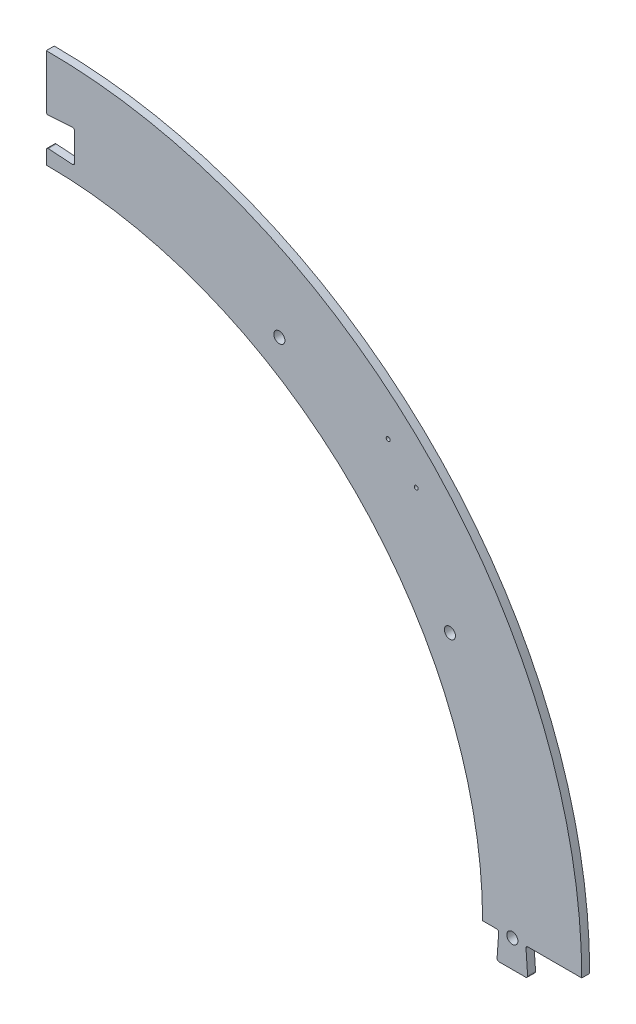
ISO-10303-21;
HEADER;
FILE_DESCRIPTION(('STEP AP214'),'2;1');
FILE_NAME('part.step','',(''),(''),'','','');
FILE_SCHEMA(('AUTOMOTIVE_DESIGN { 1 0 10303 214 1 1 1 1 }'));
ENDSEC;
DATA;
#1=APPLICATION_CONTEXT('core data for automotive mechanical design processes');
#2=APPLICATION_PROTOCOL_DEFINITION('international standard','automotive_design',2000,#1);
#3=PRODUCT_CONTEXT('',#1,'mechanical');
#4=PRODUCT('Part','Part','',(#3));
#5=PRODUCT_RELATED_PRODUCT_CATEGORY('part','',(#4));
#6=PRODUCT_DEFINITION_FORMATION('','',#4);
#7=PRODUCT_DEFINITION_CONTEXT('part definition',#1,'design');
#8=PRODUCT_DEFINITION('design','',#6,#7);
#9=PRODUCT_DEFINITION_SHAPE('','',#8);
#10=(LENGTH_UNIT() NAMED_UNIT(*) SI_UNIT(.MILLI.,.METRE.));
#11=(NAMED_UNIT(*) PLANE_ANGLE_UNIT() SI_UNIT($,.RADIAN.));
#12=(NAMED_UNIT(*) SI_UNIT($,.STERADIAN.) SOLID_ANGLE_UNIT());
#13=UNCERTAINTY_MEASURE_WITH_UNIT(LENGTH_MEASURE(1.E-05),#10,'distance_accuracy_value','');
#14=(GEOMETRIC_REPRESENTATION_CONTEXT(3) GLOBAL_UNCERTAINTY_ASSIGNED_CONTEXT((#13)) GLOBAL_UNIT_ASSIGNED_CONTEXT((#10,
#11,#12)) REPRESENTATION_CONTEXT('',''));
#15=CARTESIAN_POINT('',(0.,0.,0.));
#16=DIRECTION('',(0.,0.,1.));
#17=DIRECTION('',(1.,0.,0.));
#18=AXIS2_PLACEMENT_3D('',#15,#16,#17);
#19=CARTESIAN_POINT('',(0.,135.,2.));
#20=DIRECTION('',(1.,0.,0.));
#21=DIRECTION('',(0.,1.,0.));
#22=AXIS2_PLACEMENT_3D('',#19,#20,#21);
#23=PLANE('',#22);
#24=DIRECTION('',(0.,-1.,0.));
#25=VECTOR('',#24,1.);
#26=CARTESIAN_POINT('',(0.,135.,2.));
#27=LINE('',#26,#25);
#28=CARTESIAN_POINT('',(0.,113.362757049388,2.));
#29=VERTEX_POINT('',#28);
#30=CARTESIAN_POINT('',(0.,110.,2.));
#31=VERTEX_POINT('',#30);
#32=EDGE_CURVE('E240',#29,#31,#27,.T.);
#33=ORIENTED_EDGE('',*,*,#32,.F.);
#34=DIRECTION('',(0.,0.,1.));
#35=VECTOR('',#34,1.);
#36=CARTESIAN_POINT('',(0.,113.362757049388,2.));
#37=LINE('',#36,#35);
#38=CARTESIAN_POINT('',(0.,113.362757049388,0.));
#39=VERTEX_POINT('',#38);
#40=EDGE_CURVE('E284',#29,#39,#37,.F.);
#41=ORIENTED_EDGE('',*,*,#40,.T.);
#42=DIRECTION('',(0.,-1.,0.));
#43=VECTOR('',#42,1.);
#44=CARTESIAN_POINT('',(0.,135.,0.));
#45=LINE('',#44,#43);
#46=CARTESIAN_POINT('',(0.,110.,0.));
#47=VERTEX_POINT('',#46);
#48=EDGE_CURVE('E231',#39,#47,#45,.T.);
#49=ORIENTED_EDGE('',*,*,#48,.T.);
#50=DIRECTION('',(0.,0.,-1.));
#51=VECTOR('',#50,1.);
#52=CARTESIAN_POINT('',(0.,110.,2.));
#53=LINE('',#52,#51);
#54=EDGE_CURVE('E265',#31,#47,#53,.T.);
#55=ORIENTED_EDGE('',*,*,#54,.F.);
#56=EDGE_LOOP('',(#33,#41,#49,#55));
#57=FACE_BOUND('',#56,.T.);
#58=ADVANCED_FACE('F41',(#57),#23,.F.);
#59=CARTESIAN_POINT('',(110.,0.,2.));
#60=DIRECTION('',(0.,1.,0.));
#61=DIRECTION('',(-1.,0.,0.));
#62=AXIS2_PLACEMENT_3D('',#59,#60,#61);
#63=PLANE('',#62);
#64=DIRECTION('',(1.,0.,0.));
#65=VECTOR('',#64,1.);
#66=CARTESIAN_POINT('',(110.,0.,0.));
#67=LINE('',#66,#65);
#68=CARTESIAN_POINT('',(110.,0.,0.));
#69=VERTEX_POINT('',#68);
#70=CARTESIAN_POINT('',(113.563266604354,0.,0.));
#71=VERTEX_POINT('',#70);
#72=EDGE_CURVE('E241',#69,#71,#67,.T.);
#73=ORIENTED_EDGE('',*,*,#72,.T.);
#74=DIRECTION('',(0.,0.,-1.));
#75=VECTOR('',#74,1.);
#76=CARTESIAN_POINT('',(113.563266604354,0.,2.));
#77=LINE('',#76,#75);
#78=CARTESIAN_POINT('',(113.563266604354,0.,2.));
#79=VERTEX_POINT('',#78);
#80=EDGE_CURVE('E321',#71,#79,#77,.F.);
#81=ORIENTED_EDGE('',*,*,#80,.T.);
#82=DIRECTION('',(1.,0.,0.));
#83=VECTOR('',#82,1.);
#84=CARTESIAN_POINT('',(110.,0.,2.));
#85=LINE('',#84,#83);
#86=CARTESIAN_POINT('',(110.,0.,2.));
#87=VERTEX_POINT('',#86);
#88=EDGE_CURVE('E248',#87,#79,#85,.T.);
#89=ORIENTED_EDGE('',*,*,#88,.F.);
#90=DIRECTION('',(0.,0.,-1.));
#91=VECTOR('',#90,1.);
#92=CARTESIAN_POINT('',(110.,0.,2.));
#93=LINE('',#92,#91);
#94=EDGE_CURVE('E262',#87,#69,#93,.T.);
#95=ORIENTED_EDGE('',*,*,#94,.T.);
#96=EDGE_LOOP('',(#73,#81,#89,#95));
#97=FACE_BOUND('',#96,.T.);
#98=ADVANCED_FACE('F438',(#97),#63,.F.);
#99=CARTESIAN_POINT('',(0.,0.,0.));
#100=DIRECTION('',(0.,0.,-1.));
#101=DIRECTION('',(-1.,0.,0.));
#102=AXIS2_PLACEMENT_3D('',#99,#100,#101);
#103=PLANE('',#102);
#104=CARTESIAN_POINT('',(58.7499999999994,101.757984944672,0.));
#105=DIRECTION('',(0.,0.,1.));
#106=DIRECTION('',(1.,0.,0.));
#107=AXIS2_PLACEMENT_3D('',#104,#105,#106);
#108=CIRCLE('',#107,1.4);
#109=CARTESIAN_POINT('',(60.1499999999994,101.757984944672,0.));
#110=VERTEX_POINT('',#109);
#111=EDGE_CURVE('E384',#110,#110,#108,.T.);
#112=ORIENTED_EDGE('',*,*,#111,.T.);
#113=EDGE_LOOP('',(#112));
#114=FACE_BOUND('',#113,.T.);
#115=CARTESIAN_POINT('',(101.757984944671,58.7500000000005,0.));
#116=DIRECTION('',(0.,0.,1.));
#117=DIRECTION('',(1.,0.,0.));
#118=AXIS2_PLACEMENT_3D('',#115,#116,#117);
#119=CIRCLE('',#118,1.39999999999999);
#120=CARTESIAN_POINT('',(103.157984944671,58.7500000000005,0.));
#121=VERTEX_POINT('',#120);
#122=EDGE_CURVE('E836',#121,#121,#119,.T.);
#123=ORIENTED_EDGE('',*,*,#122,.T.);
#124=EDGE_LOOP('',(#123));
#125=FACE_BOUND('',#124,.T.);
#126=CARTESIAN_POINT('',(117.5,0.,0.));
#127=DIRECTION('',(0.,0.,1.));
#128=DIRECTION('',(1.,0.,0.));
#129=AXIS2_PLACEMENT_3D('',#126,#127,#128);
#130=CIRCLE('',#129,1.4);
#131=CARTESIAN_POINT('',(118.9,0.,0.));
#132=VERTEX_POINT('',#131);
#133=EDGE_CURVE('E393',#132,#132,#130,.T.);
#134=ORIENTED_EDGE('',*,*,#133,.T.);
#135=EDGE_LOOP('',(#134));
#136=FACE_BOUND('',#135,.T.);
#137=ORIENTED_EDGE('',*,*,#48,.F.);
#138=CARTESIAN_POINT('',(0.5,113.362757049388,0.));
#139=DIRECTION('',(0.,0.,-1.));
#140=DIRECTION('',(-1.,0.,0.));
#141=AXIS2_PLACEMENT_3D('',#138,#139,#140);
#142=CIRCLE('',#141,0.5);
#143=CARTESIAN_POINT('',(0.535623524993954,113.861486399303,0.));
#144=VERTEX_POINT('',#143);
#145=EDGE_CURVE('E291',#39,#144,#142,.T.);
#146=ORIENTED_EDGE('',*,*,#145,.T.);
#147=DIRECTION('',(0.997458699830735,-0.0712470499879106,0.));
#148=VECTOR('',#147,1.);
#149=CARTESIAN_POINT('',(-0.00712470499879618,113.900254130017,0.));
#150=LINE('',#149,#148);
#151=CARTESIAN_POINT('',(6.56437647500604,113.430861188588,0.));
#152=VERTEX_POINT('',#151);
#153=EDGE_CURVE('E383',#144,#152,#150,.T.);
#154=ORIENTED_EDGE('',*,*,#153,.T.);
#155=CARTESIAN_POINT('',(6.59999999999999,113.929590538503,0.));
#156=DIRECTION('',(0.,0.,-1.));
#157=DIRECTION('',(-1.,0.,0.));
#158=AXIS2_PLACEMENT_3D('',#155,#156,#157);
#159=CIRCLE('',#158,0.5);
#160=CARTESIAN_POINT('',(7.09999999999999,113.929590538503,0.));
#161=VERTEX_POINT('',#160);
#162=EDGE_CURVE('E328',#152,#161,#159,.F.);
#163=ORIENTED_EDGE('',*,*,#162,.T.);
#164=DIRECTION('',(0.,1.,0.));
#165=VECTOR('',#164,1.);
#166=CARTESIAN_POINT('',(7.09999999999999,113.392602365374,0.));
#167=LINE('',#166,#165);
#168=CARTESIAN_POINT('',(7.09999999999999,121.070409461497,0.));
#169=VERTEX_POINT('',#168);
#170=EDGE_CURVE('E402',#161,#169,#167,.T.);
#171=ORIENTED_EDGE('',*,*,#170,.T.);
#172=CARTESIAN_POINT('',(6.59999999999999,121.070409461497,0.));
#173=DIRECTION('',(0.,0.,-1.));
#174=DIRECTION('',(-1.,0.,0.));
#175=AXIS2_PLACEMENT_3D('',#172,#173,#174);
#176=CIRCLE('',#175,0.5);
#177=CARTESIAN_POINT('',(6.56437647500604,121.569138811412,0.));
#178=VERTEX_POINT('',#177);
#179=EDGE_CURVE('E332',#169,#178,#176,.F.);
#180=ORIENTED_EDGE('',*,*,#179,.T.);
#181=DIRECTION('',(-0.997458699830735,-0.0712470499879106,0.));
#182=VECTOR('',#181,1.);
#183=CARTESIAN_POINT('',(7.09999999999999,121.607397634626,0.));
#184=LINE('',#183,#182);
#185=CARTESIAN_POINT('',(0.535623524993952,121.138513600697,0.));
#186=VERTEX_POINT('',#185);
#187=EDGE_CURVE('E378',#178,#186,#184,.T.);
#188=ORIENTED_EDGE('',*,*,#187,.T.);
#189=CARTESIAN_POINT('',(0.5,121.637242950612,0.));
#190=DIRECTION('',(0.,0.,-1.));
#191=DIRECTION('',(-1.,0.,0.));
#192=AXIS2_PLACEMENT_3D('',#189,#190,#191);
#193=CIRCLE('',#192,0.5);
#194=CARTESIAN_POINT('',(0.,121.637242950612,0.));
#195=VERTEX_POINT('',#194);
#196=EDGE_CURVE('E289',#186,#195,#193,.T.);
#197=ORIENTED_EDGE('',*,*,#196,.T.);
#198=CARTESIAN_POINT('',(0.,125.,0.));
#199=VERTEX_POINT('',#198);
#200=EDGE_CURVE('E255',#199,#195,#45,.T.);
#201=ORIENTED_EDGE('',*,*,#200,.F.);
#202=CARTESIAN_POINT('',(0.,0.,0.));
#203=DIRECTION('',(0.,0.,1.));
#204=DIRECTION('',(1.,0.,0.));
#205=AXIS2_PLACEMENT_3D('',#202,#203,#204);
#206=CIRCLE('',#205,125.);
#207=CARTESIAN_POINT('',(125.,0.,0.));
#208=VERTEX_POINT('',#207);
#209=EDGE_CURVE('E227',#208,#199,#206,.T.);
#210=ORIENTED_EDGE('',*,*,#209,.F.);
#211=CARTESIAN_POINT('',(121.436733395646,0.,0.));
#212=VERTEX_POINT('',#211);
#213=EDGE_CURVE('E259',#212,#208,#67,.T.);
#214=ORIENTED_EDGE('',*,*,#213,.F.);
#215=CARTESIAN_POINT('',(121.436733395646,-0.500000000000001,0.));
#216=DIRECTION('',(0.,0.,-1.));
#217=DIRECTION('',(-1.,0.,0.));
#218=AXIS2_PLACEMENT_3D('',#215,#216,#217);
#219=CIRCLE('',#218,0.5);
#220=CARTESIAN_POINT('',(120.938004045731,-0.535623524993957,0.));
#221=VERTEX_POINT('',#220);
#222=EDGE_CURVE('E49',#212,#221,#219,.F.);
#223=ORIENTED_EDGE('',*,*,#222,.T.);
#224=DIRECTION('',(-0.0712470499879115,0.997458699830735,0.));
#225=VECTOR('',#224,1.);
#226=CARTESIAN_POINT('',(121.392602365374,-6.89999999999999,0.));
#227=LINE('',#226,#225);
#228=CARTESIAN_POINT('',(121.35434354216,-6.36437647500603,0.));
#229=VERTEX_POINT('',#228);
#230=EDGE_CURVE('E341',#229,#221,#227,.T.);
#231=ORIENTED_EDGE('',*,*,#230,.F.);
#232=CARTESIAN_POINT('',(120.855614192245,-6.39999999999999,0.));
#233=DIRECTION('',(0.,0.,-1.));
#234=DIRECTION('',(-1.,0.,0.));
#235=AXIS2_PLACEMENT_3D('',#232,#233,#234);
#236=CIRCLE('',#235,0.5);
#237=CARTESIAN_POINT('',(120.855614192245,-6.89999999999999,0.));
#238=VERTEX_POINT('',#237);
#239=EDGE_CURVE('E287',#229,#238,#236,.T.);
#240=ORIENTED_EDGE('',*,*,#239,.T.);
#241=DIRECTION('',(1.,0.,0.));
#242=VECTOR('',#241,1.);
#243=CARTESIAN_POINT('',(113.607397634626,-6.89999999999999,0.));
#244=LINE('',#243,#242);
#245=CARTESIAN_POINT('',(114.144385807755,-6.89999999999999,0.));
#246=VERTEX_POINT('',#245);
#247=EDGE_CURVE('E351',#246,#238,#244,.T.);
#248=ORIENTED_EDGE('',*,*,#247,.F.);
#249=CARTESIAN_POINT('',(114.144385807755,-6.39999999999999,0.));
#250=DIRECTION('',(0.,0.,-1.));
#251=DIRECTION('',(-1.,0.,0.));
#252=AXIS2_PLACEMENT_3D('',#249,#250,#251);
#253=CIRCLE('',#252,0.5);
#254=CARTESIAN_POINT('',(113.64565645784,-6.36437647500603,0.));
#255=VERTEX_POINT('',#254);
#256=EDGE_CURVE('E62',#246,#255,#253,.T.);
#257=ORIENTED_EDGE('',*,*,#256,.T.);
#258=DIRECTION('',(-0.0712470499879095,-0.997458699830735,0.));
#259=VECTOR('',#258,1.);
#260=CARTESIAN_POINT('',(114.100254777483,0.,0.));
#261=LINE('',#260,#259);
#262=CARTESIAN_POINT('',(114.061995954269,-0.535623524993957,0.));
#263=VERTEX_POINT('',#262);
#264=EDGE_CURVE('E404',#263,#255,#261,.T.);
#265=ORIENTED_EDGE('',*,*,#264,.F.);
#266=CARTESIAN_POINT('',(113.563266604354,-0.500000000000002,0.));
#267=DIRECTION('',(0.,0.,-1.));
#268=DIRECTION('',(-1.,0.,0.));
#269=AXIS2_PLACEMENT_3D('',#266,#267,#268);
#270=CIRCLE('',#269,0.5);
#271=EDGE_CURVE('E56',#263,#71,#270,.F.);
#272=ORIENTED_EDGE('',*,*,#271,.T.);
#273=ORIENTED_EDGE('',*,*,#72,.F.);
#274=CARTESIAN_POINT('',(0.,0.,0.));
#275=DIRECTION('',(0.,0.,-1.));
#276=DIRECTION('',(-1.,0.,0.));
#277=AXIS2_PLACEMENT_3D('',#274,#275,#276);
#278=CIRCLE('',#277,110.);
#279=EDGE_CURVE('E254',#47,#69,#278,.T.);
#280=ORIENTED_EDGE('',*,*,#279,.F.);
#281=EDGE_LOOP('',(#137,#146,#154,#163,#171,#180,#188,#197,#201,#210,#214,#223,#231,#240,#248,
#257,#265,#272,#273,#280));
#282=FACE_BOUND('',#281,.T.);
#283=ADVANCED_FACE('F340',(#114,#125,#136,#282),#103,.T.);
#284=CARTESIAN_POINT('',(0.,0.,2.));
#285=DIRECTION('',(0.,0.,-1.));
#286=DIRECTION('',(-1.,0.,0.));
#287=AXIS2_PLACEMENT_3D('',#284,#285,#286);
#288=CYLINDRICAL_SURFACE('',#287,135.);
#289=CARTESIAN_POINT('',(0.,0.,0.));
#290=DIRECTION('',(0.,0.,1.));
#291=DIRECTION('',(-1.,0.,0.));
#292=AXIS2_PLACEMENT_3D('',#289,#290,#291);
#293=CIRCLE('',#292,135.);
#294=CARTESIAN_POINT('',(135.,0.,0.));
#295=VERTEX_POINT('',#294);
#296=CARTESIAN_POINT('',(0.,135.,0.));
#297=VERTEX_POINT('',#296);
#298=EDGE_CURVE('E228',#295,#297,#293,.T.);
#299=ORIENTED_EDGE('',*,*,#298,.T.);
#300=DIRECTION('',(0.,0.,-1.));
#301=VECTOR('',#300,1.);
#302=CARTESIAN_POINT('',(0.,135.,2.));
#303=LINE('',#302,#301);
#304=CARTESIAN_POINT('',(0.,135.,2.));
#305=VERTEX_POINT('',#304);
#306=EDGE_CURVE('E268',#305,#297,#303,.T.);
#307=ORIENTED_EDGE('',*,*,#306,.F.);
#308=CARTESIAN_POINT('',(0.,0.,2.));
#309=DIRECTION('',(0.,0.,1.));
#310=DIRECTION('',(-1.,0.,0.));
#311=AXIS2_PLACEMENT_3D('',#308,#309,#310);
#312=CIRCLE('',#311,135.);
#313=CARTESIAN_POINT('',(135.,0.,2.));
#314=VERTEX_POINT('',#313);
#315=EDGE_CURVE('E237',#314,#305,#312,.T.);
#316=ORIENTED_EDGE('',*,*,#315,.F.);
#317=DIRECTION('',(0.,0.,-1.));
#318=VECTOR('',#317,1.);
#319=CARTESIAN_POINT('',(135.,0.,2.));
#320=LINE('',#319,#318);
#321=EDGE_CURVE('E250',#314,#295,#320,.T.);
#322=ORIENTED_EDGE('',*,*,#321,.T.);
#323=EDGE_LOOP('',(#299,#307,#316,#322));
#324=FACE_BOUND('',#323,.T.);
#325=ADVANCED_FACE('F366',(#324),#288,.T.);
#326=ORIENTED_EDGE('',*,*,#200,.T.);
#327=DIRECTION('',(0.,0.,-1.));
#328=VECTOR('',#327,1.);
#329=CARTESIAN_POINT('',(0.,121.637242950612,2.));
#330=LINE('',#329,#328);
#331=CARTESIAN_POINT('',(0.,121.637242950612,2.));
#332=VERTEX_POINT('',#331);
#333=EDGE_CURVE('E304',#195,#332,#330,.F.);
#334=ORIENTED_EDGE('',*,*,#333,.T.);
#335=EDGE_CURVE('E242',#305,#332,#27,.T.);
#336=ORIENTED_EDGE('',*,*,#335,.F.);
#337=ORIENTED_EDGE('',*,*,#306,.T.);
#338=CARTESIAN_POINT('',(0.,125.8,0.));
#339=VERTEX_POINT('',#338);
#340=EDGE_CURVE('E252',#297,#339,#45,.T.);
#341=ORIENTED_EDGE('',*,*,#340,.T.);
#342=DIRECTION('',(0.,0.,1.));
#343=VECTOR('',#342,1.);
#344=CARTESIAN_POINT('',(0.,125.8,-2.));
#345=LINE('',#344,#343);
#346=CARTESIAN_POINT('',(0.,125.8,-2.));
#347=VERTEX_POINT('',#346);
#348=EDGE_CURVE('E210',#347,#339,#345,.T.);
#349=ORIENTED_EDGE('',*,*,#348,.F.);
#350=DIRECTION('',(0.,1.,0.));
#351=VECTOR('',#350,1.);
#352=CARTESIAN_POINT('',(0.,125.8,-2.));
#353=LINE('',#352,#351);
#354=CARTESIAN_POINT('',(0.,125.,-2.));
#355=VERTEX_POINT('',#354);
#356=EDGE_CURVE('E201',#355,#347,#353,.T.);
#357=ORIENTED_EDGE('',*,*,#356,.F.);
#358=DIRECTION('',(0.,0.,1.));
#359=VECTOR('',#358,1.);
#360=CARTESIAN_POINT('',(0.,125.,-2.));
#361=LINE('',#360,#359);
#362=EDGE_CURVE('E206',#355,#199,#361,.T.);
#363=ORIENTED_EDGE('',*,*,#362,.T.);
#364=EDGE_LOOP('',(#326,#334,#336,#337,#341,#349,#357,#363));
#365=FACE_BOUND('',#364,.T.);
#366=ADVANCED_FACE('F204',(#365),#23,.F.);
#367=CARTESIAN_POINT('',(0.,0.,2.));
#368=DIRECTION('',(0.,0.,-1.));
#369=DIRECTION('',(-1.,0.,0.));
#370=AXIS2_PLACEMENT_3D('',#367,#368,#369);
#371=CYLINDRICAL_SURFACE('',#370,110.);
#372=ORIENTED_EDGE('',*,*,#279,.T.);
#373=ORIENTED_EDGE('',*,*,#94,.F.);
#374=CARTESIAN_POINT('',(0.,0.,2.));
#375=DIRECTION('',(0.,0.,-1.));
#376=DIRECTION('',(-1.,0.,0.));
#377=AXIS2_PLACEMENT_3D('',#374,#375,#376);
#378=CIRCLE('',#377,110.);
#379=EDGE_CURVE('E245',#31,#87,#378,.T.);
#380=ORIENTED_EDGE('',*,*,#379,.F.);
#381=ORIENTED_EDGE('',*,*,#54,.T.);
#382=EDGE_LOOP('',(#372,#373,#380,#381));
#383=FACE_BOUND('',#382,.T.);
#384=ADVANCED_FACE('F434',(#383),#371,.F.);
#385=CARTESIAN_POINT('',(121.436733395646,0.,2.));
#386=VERTEX_POINT('',#385);
#387=EDGE_CURVE('E247',#386,#314,#85,.T.);
#388=ORIENTED_EDGE('',*,*,#387,.F.);
#389=DIRECTION('',(0.,0.,-1.));
#390=VECTOR('',#389,1.);
#391=CARTESIAN_POINT('',(121.436733395646,0.,0.));
#392=LINE('',#391,#390);
#393=EDGE_CURVE('E323',#386,#212,#392,.T.);
#394=ORIENTED_EDGE('',*,*,#393,.T.);
#395=ORIENTED_EDGE('',*,*,#213,.T.);
#396=DIRECTION('',(0.,0.,1.));
#397=VECTOR('',#396,1.);
#398=CARTESIAN_POINT('',(125.,0.,-2.));
#399=LINE('',#398,#397);
#400=CARTESIAN_POINT('',(125.,0.,-2.));
#401=VERTEX_POINT('',#400);
#402=EDGE_CURVE('E417',#401,#208,#399,.T.);
#403=ORIENTED_EDGE('',*,*,#402,.F.);
#404=DIRECTION('',(-1.,0.,0.));
#405=VECTOR('',#404,1.);
#406=CARTESIAN_POINT('',(125.8,0.,-2.));
#407=LINE('',#406,#405);
#408=CARTESIAN_POINT('',(125.8,0.,-2.));
#409=VERTEX_POINT('',#408);
#410=EDGE_CURVE('E219',#409,#401,#407,.T.);
#411=ORIENTED_EDGE('',*,*,#410,.F.);
#412=DIRECTION('',(0.,0.,1.));
#413=VECTOR('',#412,1.);
#414=CARTESIAN_POINT('',(125.8,0.,-2.));
#415=LINE('',#414,#413);
#416=CARTESIAN_POINT('',(125.8,0.,0.));
#417=VERTEX_POINT('',#416);
#418=EDGE_CURVE('E233',#409,#417,#415,.T.);
#419=ORIENTED_EDGE('',*,*,#418,.T.);
#420=EDGE_CURVE('E257',#417,#295,#67,.T.);
#421=ORIENTED_EDGE('',*,*,#420,.T.);
#422=ORIENTED_EDGE('',*,*,#321,.F.);
#423=EDGE_LOOP('',(#388,#394,#395,#403,#411,#419,#421,#422));
#424=FACE_BOUND('',#423,.T.);
#425=ADVANCED_FACE('F360',(#424),#63,.F.);
#426=CARTESIAN_POINT('',(0.,0.,2.));
#427=DIRECTION('',(0.,0.,-1.));
#428=DIRECTION('',(-1.,0.,0.));
#429=AXIS2_PLACEMENT_3D('',#426,#427,#428);
#430=PLANE('',#429);
#431=CARTESIAN_POINT('',(93.2684710026309,86.1974031907655,2.));
#432=DIRECTION('',(0.,0.,-1.));
#433=DIRECTION('',(-1.,0.,0.));
#434=AXIS2_PLACEMENT_3D('',#431,#432,#433);
#435=CIRCLE('',#434,0.499999999999999);
#436=CARTESIAN_POINT('',(92.7684710026309,86.1974031907655,2.));
#437=VERTEX_POINT('',#436);
#438=EDGE_CURVE('E819',#437,#437,#435,.F.);
#439=ORIENTED_EDGE('',*,*,#438,.F.);
#440=EDGE_LOOP('',(#439));
#441=FACE_BOUND('',#440,.T.);
#442=CARTESIAN_POINT('',(86.1974031907655,93.268471002631,2.));
#443=DIRECTION('',(0.,0.,-1.));
#444=DIRECTION('',(-1.,0.,0.));
#445=AXIS2_PLACEMENT_3D('',#442,#443,#444);
#446=CIRCLE('',#445,0.499999999999999);
#447=CARTESIAN_POINT('',(85.6974031907655,93.268471002631,2.));
#448=VERTEX_POINT('',#447);
#449=EDGE_CURVE('E826',#448,#448,#446,.F.);
#450=ORIENTED_EDGE('',*,*,#449,.F.);
#451=EDGE_LOOP('',(#450));
#452=FACE_BOUND('',#451,.T.);
#453=CARTESIAN_POINT('',(58.7499999999994,101.757984944672,2.));
#454=DIRECTION('',(0.,0.,-1.));
#455=DIRECTION('',(-1.,0.,0.));
#456=AXIS2_PLACEMENT_3D('',#453,#454,#455);
#457=CIRCLE('',#456,1.4);
#458=CARTESIAN_POINT('',(57.3499999999994,101.757984944672,2.));
#459=VERTEX_POINT('',#458);
#460=EDGE_CURVE('E390',#459,#459,#457,.T.);
#461=ORIENTED_EDGE('',*,*,#460,.T.);
#462=EDGE_LOOP('',(#461));
#463=FACE_BOUND('',#462,.T.);
#464=CARTESIAN_POINT('',(101.757984944671,58.7500000000005,2.));
#465=DIRECTION('',(0.,0.,-1.));
#466=DIRECTION('',(-1.,0.,0.));
#467=AXIS2_PLACEMENT_3D('',#464,#465,#466);
#468=CIRCLE('',#467,1.39999999999999);
#469=CARTESIAN_POINT('',(100.357984944671,58.7500000000005,2.));
#470=VERTEX_POINT('',#469);
#471=EDGE_CURVE('E833',#470,#470,#468,.T.);
#472=ORIENTED_EDGE('',*,*,#471,.T.);
#473=EDGE_LOOP('',(#472));
#474=FACE_BOUND('',#473,.T.);
#475=CARTESIAN_POINT('',(117.5,0.,2.));
#476=DIRECTION('',(0.,0.,-1.));
#477=DIRECTION('',(-1.,0.,0.));
#478=AXIS2_PLACEMENT_3D('',#475,#476,#477);
#479=CIRCLE('',#478,1.4);
#480=CARTESIAN_POINT('',(116.1,0.,2.));
#481=VERTEX_POINT('',#480);
#482=EDGE_CURVE('E822',#481,#481,#479,.T.);
#483=ORIENTED_EDGE('',*,*,#482,.T.);
#484=EDGE_LOOP('',(#483));
#485=FACE_BOUND('',#484,.T.);
#486=DIRECTION('',(0.997458699830735,-0.0712470499879106,0.));
#487=VECTOR('',#486,1.);
#488=CARTESIAN_POINT('',(-0.00712470499879618,113.900254130017,2.));
#489=LINE('',#488,#487);
#490=CARTESIAN_POINT('',(0.535623524993953,113.861486399303,2.));
#491=VERTEX_POINT('',#490);
#492=CARTESIAN_POINT('',(6.56437647500604,113.430861188588,2.));
#493=VERTEX_POINT('',#492);
#494=EDGE_CURVE('E387',#491,#493,#489,.T.);
#495=ORIENTED_EDGE('',*,*,#494,.F.);
#496=CARTESIAN_POINT('',(0.5,113.362757049388,2.));
#497=DIRECTION('',(0.,0.,-1.));
#498=DIRECTION('',(-1.,0.,0.));
#499=AXIS2_PLACEMENT_3D('',#496,#497,#498);
#500=CIRCLE('',#499,0.5);
#501=EDGE_CURVE('E282',#491,#29,#500,.F.);
#502=ORIENTED_EDGE('',*,*,#501,.T.);
#503=ORIENTED_EDGE('',*,*,#32,.T.);
#504=ORIENTED_EDGE('',*,*,#379,.T.);
#505=ORIENTED_EDGE('',*,*,#88,.T.);
#506=CARTESIAN_POINT('',(113.563266604354,-0.500000000000002,2.));
#507=DIRECTION('',(0.,0.,-1.));
#508=DIRECTION('',(-1.,0.,0.));
#509=AXIS2_PLACEMENT_3D('',#506,#507,#508);
#510=CIRCLE('',#509,0.5);
#511=CARTESIAN_POINT('',(114.061995954269,-0.535623524993957,2.));
#512=VERTEX_POINT('',#511);
#513=EDGE_CURVE('E335',#79,#512,#510,.T.);
#514=ORIENTED_EDGE('',*,*,#513,.T.);
#515=DIRECTION('',(0.0712470499879095,0.997458699830735,0.));
#516=VECTOR('',#515,1.);
#517=CARTESIAN_POINT('',(114.100254777483,0.,2.));
#518=LINE('',#517,#516);
#519=CARTESIAN_POINT('',(113.64565645784,-6.36437647500603,2.));
#520=VERTEX_POINT('',#519);
#521=EDGE_CURVE('E409',#520,#512,#518,.T.);
#522=ORIENTED_EDGE('',*,*,#521,.F.);
#523=CARTESIAN_POINT('',(114.144385807755,-6.39999999999999,2.));
#524=DIRECTION('',(0.,0.,-1.));
#525=DIRECTION('',(-1.,0.,0.));
#526=AXIS2_PLACEMENT_3D('',#523,#524,#525);
#527=CIRCLE('',#526,0.5);
#528=CARTESIAN_POINT('',(114.144385807755,-6.89999999999999,2.));
#529=VERTEX_POINT('',#528);
#530=EDGE_CURVE('E276',#520,#529,#527,.F.);
#531=ORIENTED_EDGE('',*,*,#530,.T.);
#532=DIRECTION('',(-1.,0.,0.));
#533=VECTOR('',#532,1.);
#534=CARTESIAN_POINT('',(113.607397634626,-6.89999999999999,2.));
#535=LINE('',#534,#533);
#536=CARTESIAN_POINT('',(120.855614192245,-6.89999999999999,2.));
#537=VERTEX_POINT('',#536);
#538=EDGE_CURVE('E406',#537,#529,#535,.T.);
#539=ORIENTED_EDGE('',*,*,#538,.F.);
#540=CARTESIAN_POINT('',(120.855614192245,-6.39999999999999,2.));
#541=DIRECTION('',(0.,0.,-1.));
#542=DIRECTION('',(-1.,0.,0.));
#543=AXIS2_PLACEMENT_3D('',#540,#541,#542);
#544=CIRCLE('',#543,0.5);
#545=CARTESIAN_POINT('',(121.35434354216,-6.36437647500603,2.));
#546=VERTEX_POINT('',#545);
#547=EDGE_CURVE('E278',#537,#546,#544,.F.);
#548=ORIENTED_EDGE('',*,*,#547,.T.);
#549=DIRECTION('',(0.0712470499879115,-0.997458699830735,0.));
#550=VECTOR('',#549,1.);
#551=CARTESIAN_POINT('',(121.392602365374,-6.89999999999999,2.));
#552=LINE('',#551,#550);
#553=CARTESIAN_POINT('',(120.938004045731,-0.535623524993957,2.));
#554=VERTEX_POINT('',#553);
#555=EDGE_CURVE('E350',#554,#546,#552,.T.);
#556=ORIENTED_EDGE('',*,*,#555,.F.);
#557=CARTESIAN_POINT('',(121.436733395646,-0.500000000000001,2.));
#558=DIRECTION('',(0.,0.,-1.));
#559=DIRECTION('',(-1.,0.,0.));
#560=AXIS2_PLACEMENT_3D('',#557,#558,#559);
#561=CIRCLE('',#560,0.5);
#562=EDGE_CURVE('E11',#554,#386,#561,.T.);
#563=ORIENTED_EDGE('',*,*,#562,.T.);
#564=ORIENTED_EDGE('',*,*,#387,.T.);
#565=ORIENTED_EDGE('',*,*,#315,.T.);
#566=ORIENTED_EDGE('',*,*,#335,.T.);
#567=CARTESIAN_POINT('',(0.5,121.637242950612,2.));
#568=DIRECTION('',(0.,0.,-1.));
#569=DIRECTION('',(-1.,0.,0.));
#570=AXIS2_PLACEMENT_3D('',#567,#568,#569);
#571=CIRCLE('',#570,0.5);
#572=CARTESIAN_POINT('',(0.535623524993953,121.138513600697,2.));
#573=VERTEX_POINT('',#572);
#574=EDGE_CURVE('E280',#332,#573,#571,.F.);
#575=ORIENTED_EDGE('',*,*,#574,.T.);
#576=DIRECTION('',(-0.997458699830735,-0.0712470499879106,0.));
#577=VECTOR('',#576,1.);
#578=CARTESIAN_POINT('',(7.09999999999999,121.607397634626,2.));
#579=LINE('',#578,#577);
#580=CARTESIAN_POINT('',(6.56437647500604,121.569138811412,2.));
#581=VERTEX_POINT('',#580);
#582=EDGE_CURVE('E380',#581,#573,#579,.T.);
#583=ORIENTED_EDGE('',*,*,#582,.F.);
#584=CARTESIAN_POINT('',(6.59999999999999,121.070409461497,2.));
#585=DIRECTION('',(0.,0.,-1.));
#586=DIRECTION('',(-1.,0.,0.));
#587=AXIS2_PLACEMENT_3D('',#584,#585,#586);
#588=CIRCLE('',#587,0.5);
#589=CARTESIAN_POINT('',(7.09999999999999,121.070409461497,2.));
#590=VERTEX_POINT('',#589);
#591=EDGE_CURVE('E330',#581,#590,#588,.T.);
#592=ORIENTED_EDGE('',*,*,#591,.T.);
#593=DIRECTION('',(0.,1.,0.));
#594=VECTOR('',#593,1.);
#595=CARTESIAN_POINT('',(7.09999999999999,113.392602365374,2.));
#596=LINE('',#595,#594);
#597=CARTESIAN_POINT('',(7.09999999999999,113.929590538503,2.));
#598=VERTEX_POINT('',#597);
#599=EDGE_CURVE('E398',#598,#590,#596,.T.);
#600=ORIENTED_EDGE('',*,*,#599,.F.);
#601=CARTESIAN_POINT('',(6.59999999999999,113.929590538503,2.));
#602=DIRECTION('',(0.,0.,-1.));
#603=DIRECTION('',(-1.,0.,0.));
#604=AXIS2_PLACEMENT_3D('',#601,#602,#603);
#605=CIRCLE('',#604,0.5);
#606=EDGE_CURVE('E326',#598,#493,#605,.T.);
#607=ORIENTED_EDGE('',*,*,#606,.T.);
#608=EDGE_LOOP('',(#495,#502,#503,#504,#505,#514,#522,#531,#539,#548,#556,#563,#564,#565,#566,
#575,#583,#592,#600,#607));
#609=FACE_BOUND('',#608,.T.);
#610=ADVANCED_FACE('F357',(#441,#452,#463,#474,#485,#609),#430,.F.);
#611=CARTESIAN_POINT('',(93.2684710026309,86.1974031907655,0.));
#612=DIRECTION('',(0.,0.,-1.));
#613=DIRECTION('',(-1.,0.,0.));
#614=AXIS2_PLACEMENT_3D('',#611,#612,#613);
#615=CIRCLE('',#614,0.499999999999999);
#616=CARTESIAN_POINT('',(92.7684710026309,86.1974031907655,0.));
#617=VERTEX_POINT('',#616);
#618=EDGE_CURVE('E816',#617,#617,#615,.T.);
#619=ORIENTED_EDGE('',*,*,#618,.F.);
#620=EDGE_LOOP('',(#619));
#621=FACE_BOUND('',#620,.T.);
#622=CARTESIAN_POINT('',(86.1974031907655,93.268471002631,0.));
#623=DIRECTION('',(0.,0.,-1.));
#624=DIRECTION('',(-1.,0.,0.));
#625=AXIS2_PLACEMENT_3D('',#622,#623,#624);
#626=CIRCLE('',#625,0.499999999999999);
#627=CARTESIAN_POINT('',(85.6974031907655,93.268471002631,0.));
#628=VERTEX_POINT('',#627);
#629=EDGE_CURVE('E823',#628,#628,#626,.T.);
#630=ORIENTED_EDGE('',*,*,#629,.F.);
#631=EDGE_LOOP('',(#630));
#632=FACE_BOUND('',#631,.T.);
#633=CARTESIAN_POINT('',(0.,0.,0.));
#634=DIRECTION('',(0.,0.,-1.));
#635=DIRECTION('',(1.,0.,0.));
#636=AXIS2_PLACEMENT_3D('',#633,#634,#635);
#637=CIRCLE('',#636,125.8);
#638=EDGE_CURVE('E223',#339,#417,#637,.T.);
#639=ORIENTED_EDGE('',*,*,#638,.F.);
#640=ORIENTED_EDGE('',*,*,#340,.F.);
#641=ORIENTED_EDGE('',*,*,#298,.F.);
#642=ORIENTED_EDGE('',*,*,#420,.F.);
#643=EDGE_LOOP('',(#639,#640,#641,#642));
#644=FACE_BOUND('',#643,.T.);
#645=ADVANCED_FACE('F425',(#621,#632,#644),#103,.T.);
#646=CARTESIAN_POINT('',(0.,0.,-2.));
#647=DIRECTION('',(0.,0.,1.));
#648=DIRECTION('',(1.,0.,0.));
#649=AXIS2_PLACEMENT_3D('',#646,#647,#648);
#650=CYLINDRICAL_SURFACE('',#649,125.);
#651=ORIENTED_EDGE('',*,*,#209,.T.);
#652=ORIENTED_EDGE('',*,*,#362,.F.);
#653=CARTESIAN_POINT('',(0.,0.,-2.));
#654=DIRECTION('',(0.,0.,1.));
#655=DIRECTION('',(1.,0.,0.));
#656=AXIS2_PLACEMENT_3D('',#653,#654,#655);
#657=CIRCLE('',#656,125.);
#658=EDGE_CURVE('E214',#401,#355,#657,.T.);
#659=ORIENTED_EDGE('',*,*,#658,.F.);
#660=ORIENTED_EDGE('',*,*,#402,.T.);
#661=EDGE_LOOP('',(#651,#652,#659,#660));
#662=FACE_BOUND('',#661,.T.);
#663=ADVANCED_FACE('F225',(#662),#650,.F.);
#664=CARTESIAN_POINT('',(0.,0.,-2.));
#665=DIRECTION('',(0.,0.,1.));
#666=DIRECTION('',(1.,0.,0.));
#667=AXIS2_PLACEMENT_3D('',#664,#665,#666);
#668=CYLINDRICAL_SURFACE('',#667,125.8);
#669=ORIENTED_EDGE('',*,*,#638,.T.);
#670=ORIENTED_EDGE('',*,*,#418,.F.);
#671=CARTESIAN_POINT('',(0.,0.,-2.));
#672=DIRECTION('',(0.,0.,-1.));
#673=DIRECTION('',(1.,0.,0.));
#674=AXIS2_PLACEMENT_3D('',#671,#672,#673);
#675=CIRCLE('',#674,125.8);
#676=EDGE_CURVE('E213',#347,#409,#675,.T.);
#677=ORIENTED_EDGE('',*,*,#676,.F.);
#678=ORIENTED_EDGE('',*,*,#348,.T.);
#679=EDGE_LOOP('',(#669,#670,#677,#678));
#680=FACE_BOUND('',#679,.T.);
#681=ADVANCED_FACE('F423',(#680),#668,.T.);
#682=CARTESIAN_POINT('',(0.,0.,-2.));
#683=DIRECTION('',(0.,0.,1.));
#684=DIRECTION('',(1.,0.,0.));
#685=AXIS2_PLACEMENT_3D('',#682,#683,#684);
#686=PLANE('',#685);
#687=ORIENTED_EDGE('',*,*,#658,.T.);
#688=ORIENTED_EDGE('',*,*,#356,.T.);
#689=ORIENTED_EDGE('',*,*,#676,.T.);
#690=ORIENTED_EDGE('',*,*,#410,.T.);
#691=EDGE_LOOP('',(#687,#688,#689,#690));
#692=FACE_BOUND('',#691,.T.);
#693=ADVANCED_FACE('F217',(#692),#686,.F.);
#694=CARTESIAN_POINT('',(121.392602365374,-6.89999999999999,12.4028559876443));
#695=DIRECTION('',(-0.997458699830735,-0.0712470499879115,0.));
#696=DIRECTION('',(0.0712470499879115,-0.997458699830735,0.));
#697=AXIS2_PLACEMENT_3D('',#694,#695,#696);
#698=PLANE('',#697);
#699=ORIENTED_EDGE('',*,*,#555,.T.);
#700=DIRECTION('',(0.,0.,-1.));
#701=VECTOR('',#700,1.);
#702=CARTESIAN_POINT('',(121.35434354216,-6.36437647500603,12.4028559876443));
#703=LINE('',#702,#701);
#704=EDGE_CURVE('E308',#546,#229,#703,.T.);
#705=ORIENTED_EDGE('',*,*,#704,.T.);
#706=ORIENTED_EDGE('',*,*,#230,.T.);
#707=DIRECTION('',(0.,0.,-1.));
#708=VECTOR('',#707,1.);
#709=CARTESIAN_POINT('',(120.938004045731,-0.535623524993957,2.));
#710=LINE('',#709,#708);
#711=EDGE_CURVE('E306',#221,#554,#710,.F.);
#712=ORIENTED_EDGE('',*,*,#711,.T.);
#713=EDGE_LOOP('',(#699,#705,#706,#712));
#714=FACE_BOUND('',#713,.T.);
#715=ADVANCED_FACE('F347',(#714),#698,.F.);
#716=CARTESIAN_POINT('',(113.607397634626,-6.89999999999999,12.4028559876443));
#717=DIRECTION('',(0.,1.,0.));
#718=DIRECTION('',(-1.,0.,0.));
#719=AXIS2_PLACEMENT_3D('',#716,#717,#718);
#720=PLANE('',#719);
#721=ORIENTED_EDGE('',*,*,#247,.T.);
#722=DIRECTION('',(0.,0.,-1.));
#723=VECTOR('',#722,1.);
#724=CARTESIAN_POINT('',(120.855614192245,-6.89999999999999,12.4028559876443));
#725=LINE('',#724,#723);
#726=EDGE_CURVE('E314',#238,#537,#725,.F.);
#727=ORIENTED_EDGE('',*,*,#726,.T.);
#728=ORIENTED_EDGE('',*,*,#538,.T.);
#729=DIRECTION('',(0.,0.,-1.));
#730=VECTOR('',#729,1.);
#731=CARTESIAN_POINT('',(114.144385807755,-6.89999999999999,12.4028559876443));
#732=LINE('',#731,#730);
#733=EDGE_CURVE('E311',#529,#246,#732,.T.);
#734=ORIENTED_EDGE('',*,*,#733,.T.);
#735=EDGE_LOOP('',(#721,#727,#728,#734));
#736=FACE_BOUND('',#735,.T.);
#737=ADVANCED_FACE('F455',(#736),#720,.F.);
#738=CARTESIAN_POINT('',(114.100254777483,0.,12.4028559876443));
#739=DIRECTION('',(0.997458699830735,-0.0712470499879095,0.));
#740=DIRECTION('',(0.0712470499879095,0.997458699830735,0.));
#741=AXIS2_PLACEMENT_3D('',#738,#739,#740);
#742=PLANE('',#741);
#743=ORIENTED_EDGE('',*,*,#264,.T.);
#744=DIRECTION('',(0.,0.,-1.));
#745=VECTOR('',#744,1.);
#746=CARTESIAN_POINT('',(113.64565645784,-6.36437647500603,12.4028559876443));
#747=LINE('',#746,#745);
#748=EDGE_CURVE('E319',#255,#520,#747,.F.);
#749=ORIENTED_EDGE('',*,*,#748,.T.);
#750=ORIENTED_EDGE('',*,*,#521,.T.);
#751=DIRECTION('',(0.,0.,-1.));
#752=VECTOR('',#751,1.);
#753=CARTESIAN_POINT('',(114.061995954269,-0.535623524993957,0.));
#754=LINE('',#753,#752);
#755=EDGE_CURVE('E316',#512,#263,#754,.T.);
#756=ORIENTED_EDGE('',*,*,#755,.T.);
#757=EDGE_LOOP('',(#743,#749,#750,#756));
#758=FACE_BOUND('',#757,.T.);
#759=ADVANCED_FACE('F447',(#758),#742,.F.);
#760=CARTESIAN_POINT('',(-0.00712470499879618,113.900254130017,-2.001));
#761=DIRECTION('',(-0.0712470499879106,-0.997458699830735,0.));
#762=DIRECTION('',(0.997458699830735,-0.0712470499879106,0.));
#763=AXIS2_PLACEMENT_3D('',#760,#761,#762);
#764=PLANE('',#763);
#765=ORIENTED_EDGE('',*,*,#153,.F.);
#766=DIRECTION('',(0.,0.,1.));
#767=VECTOR('',#766,1.);
#768=CARTESIAN_POINT('',(0.535623524993954,113.861486399303,-2.001));
#769=LINE('',#768,#767);
#770=EDGE_CURVE('E273',#144,#491,#769,.T.);
#771=ORIENTED_EDGE('',*,*,#770,.T.);
#772=ORIENTED_EDGE('',*,*,#494,.T.);
#773=DIRECTION('',(0.,0.,1.));
#774=VECTOR('',#773,1.);
#775=CARTESIAN_POINT('',(6.56437647500604,113.430861188588,0.));
#776=LINE('',#775,#774);
#777=EDGE_CURVE('E271',#493,#152,#776,.F.);
#778=ORIENTED_EDGE('',*,*,#777,.T.);
#779=EDGE_LOOP('',(#765,#771,#772,#778));
#780=FACE_BOUND('',#779,.T.);
#781=ADVANCED_FACE('F509',(#780),#764,.F.);
#782=CARTESIAN_POINT('',(7.09999999999999,121.607397634626,-2.001));
#783=DIRECTION('',(-0.0712470499879106,0.997458699830735,0.));
#784=DIRECTION('',(-0.997458699830735,-0.0712470499879106,0.));
#785=AXIS2_PLACEMENT_3D('',#782,#783,#784);
#786=PLANE('',#785);
#787=ORIENTED_EDGE('',*,*,#187,.F.);
#788=DIRECTION('',(0.,0.,1.));
#789=VECTOR('',#788,1.);
#790=CARTESIAN_POINT('',(6.56437647500604,121.569138811412,2.));
#791=LINE('',#790,#789);
#792=EDGE_CURVE('E301',#178,#581,#791,.T.);
#793=ORIENTED_EDGE('',*,*,#792,.T.);
#794=ORIENTED_EDGE('',*,*,#582,.T.);
#795=DIRECTION('',(0.,0.,-1.));
#796=VECTOR('',#795,1.);
#797=CARTESIAN_POINT('',(0.535623524993954,121.138513600697,-2.001));
#798=LINE('',#797,#796);
#799=EDGE_CURVE('E298',#573,#186,#798,.T.);
#800=ORIENTED_EDGE('',*,*,#799,.T.);
#801=EDGE_LOOP('',(#787,#793,#794,#800));
#802=FACE_BOUND('',#801,.T.);
#803=ADVANCED_FACE('F377',(#802),#786,.F.);
#804=CARTESIAN_POINT('',(7.09999999999999,113.392602365374,-2.001));
#805=DIRECTION('',(1.,0.,0.));
#806=DIRECTION('',(0.,1.,0.));
#807=AXIS2_PLACEMENT_3D('',#804,#805,#806);
#808=PLANE('',#807);
#809=ORIENTED_EDGE('',*,*,#170,.F.);
#810=DIRECTION('',(0.,0.,1.));
#811=VECTOR('',#810,1.);
#812=CARTESIAN_POINT('',(7.09999999999999,113.929590538503,2.));
#813=LINE('',#812,#811);
#814=EDGE_CURVE('E295',#161,#598,#813,.T.);
#815=ORIENTED_EDGE('',*,*,#814,.T.);
#816=ORIENTED_EDGE('',*,*,#599,.T.);
#817=DIRECTION('',(0.,0.,1.));
#818=VECTOR('',#817,1.);
#819=CARTESIAN_POINT('',(7.09999999999999,121.070409461497,0.));
#820=LINE('',#819,#818);
#821=EDGE_CURVE('E293',#590,#169,#820,.F.);
#822=ORIENTED_EDGE('',*,*,#821,.T.);
#823=EDGE_LOOP('',(#809,#815,#816,#822));
#824=FACE_BOUND('',#823,.T.);
#825=ADVANCED_FACE('F491',(#824),#808,.F.);
#826=CARTESIAN_POINT('',(0.5,113.362757049388,-2.001));
#827=DIRECTION('',(0.,0.,1.));
#828=DIRECTION('',(1.,0.,0.));
#829=AXIS2_PLACEMENT_3D('',#826,#827,#828);
#830=CYLINDRICAL_SURFACE('',#829,0.5);
#831=ORIENTED_EDGE('',*,*,#145,.F.);
#832=ORIENTED_EDGE('',*,*,#40,.F.);
#833=ORIENTED_EDGE('',*,*,#501,.F.);
#834=ORIENTED_EDGE('',*,*,#770,.F.);
#835=EDGE_LOOP('',(#831,#832,#833,#834));
#836=FACE_BOUND('',#835,.T.);
#837=ADVANCED_FACE('F487',(#836),#830,.T.);
#838=CARTESIAN_POINT('',(6.59999999999999,113.929590538503,-2.001));
#839=DIRECTION('',(0.,0.,-1.));
#840=DIRECTION('',(-1.,0.,0.));
#841=AXIS2_PLACEMENT_3D('',#838,#839,#840);
#842=CYLINDRICAL_SURFACE('',#841,0.5);
#843=ORIENTED_EDGE('',*,*,#162,.F.);
#844=ORIENTED_EDGE('',*,*,#777,.F.);
#845=ORIENTED_EDGE('',*,*,#606,.F.);
#846=ORIENTED_EDGE('',*,*,#814,.F.);
#847=EDGE_LOOP('',(#843,#844,#845,#846));
#848=FACE_BOUND('',#847,.T.);
#849=ADVANCED_FACE('F490',(#848),#842,.F.);
#850=CARTESIAN_POINT('',(6.59999999999999,121.070409461497,-2.001));
#851=DIRECTION('',(0.,0.,-1.));
#852=DIRECTION('',(-1.,0.,0.));
#853=AXIS2_PLACEMENT_3D('',#850,#851,#852);
#854=CYLINDRICAL_SURFACE('',#853,0.5);
#855=ORIENTED_EDGE('',*,*,#179,.F.);
#856=ORIENTED_EDGE('',*,*,#821,.F.);
#857=ORIENTED_EDGE('',*,*,#591,.F.);
#858=ORIENTED_EDGE('',*,*,#792,.F.);
#859=EDGE_LOOP('',(#855,#856,#857,#858));
#860=FACE_BOUND('',#859,.T.);
#861=ADVANCED_FACE('F466',(#860),#854,.F.);
#862=CARTESIAN_POINT('',(0.5,121.637242950612,-2.001));
#863=DIRECTION('',(0.,0.,-1.));
#864=DIRECTION('',(-1.,0.,0.));
#865=AXIS2_PLACEMENT_3D('',#862,#863,#864);
#866=CYLINDRICAL_SURFACE('',#865,0.5);
#867=ORIENTED_EDGE('',*,*,#574,.F.);
#868=ORIENTED_EDGE('',*,*,#333,.F.);
#869=ORIENTED_EDGE('',*,*,#196,.F.);
#870=ORIENTED_EDGE('',*,*,#799,.F.);
#871=EDGE_LOOP('',(#867,#868,#869,#870));
#872=FACE_BOUND('',#871,.T.);
#873=ADVANCED_FACE('F373',(#872),#866,.T.);
#874=CARTESIAN_POINT('',(120.855614192245,-6.39999999999999,12.4028559876443));
#875=DIRECTION('',(0.,0.,-1.));
#876=DIRECTION('',(-1.,0.,0.));
#877=AXIS2_PLACEMENT_3D('',#874,#875,#876);
#878=CYLINDRICAL_SURFACE('',#877,0.5);
#879=ORIENTED_EDGE('',*,*,#547,.F.);
#880=ORIENTED_EDGE('',*,*,#726,.F.);
#881=ORIENTED_EDGE('',*,*,#239,.F.);
#882=ORIENTED_EDGE('',*,*,#704,.F.);
#883=EDGE_LOOP('',(#879,#880,#881,#882));
#884=FACE_BOUND('',#883,.T.);
#885=ADVANCED_FACE('F458',(#884),#878,.T.);
#886=CARTESIAN_POINT('',(114.144385807755,-6.39999999999999,12.4028559876443));
#887=DIRECTION('',(0.,0.,-1.));
#888=DIRECTION('',(-1.,0.,0.));
#889=AXIS2_PLACEMENT_3D('',#886,#887,#888);
#890=CYLINDRICAL_SURFACE('',#889,0.5);
#891=ORIENTED_EDGE('',*,*,#530,.F.);
#892=ORIENTED_EDGE('',*,*,#748,.F.);
#893=ORIENTED_EDGE('',*,*,#256,.F.);
#894=ORIENTED_EDGE('',*,*,#733,.F.);
#895=EDGE_LOOP('',(#891,#892,#893,#894));
#896=FACE_BOUND('',#895,.T.);
#897=ADVANCED_FACE('F450',(#896),#890,.T.);
#898=CARTESIAN_POINT('',(113.563266604354,-0.500000000000002,12.4028559876443));
#899=DIRECTION('',(0.,0.,1.));
#900=DIRECTION('',(1.,0.,0.));
#901=AXIS2_PLACEMENT_3D('',#898,#899,#900);
#902=CYLINDRICAL_SURFACE('',#901,0.5);
#903=ORIENTED_EDGE('',*,*,#513,.F.);
#904=ORIENTED_EDGE('',*,*,#80,.F.);
#905=ORIENTED_EDGE('',*,*,#271,.F.);
#906=ORIENTED_EDGE('',*,*,#755,.F.);
#907=EDGE_LOOP('',(#903,#904,#905,#906));
#908=FACE_BOUND('',#907,.T.);
#909=ADVANCED_FACE('F442',(#908),#902,.F.);
#910=CARTESIAN_POINT('',(121.436733395646,-0.500000000000001,2.));
#911=DIRECTION('',(0.,0.,1.));
#912=DIRECTION('',(1.,0.,0.));
#913=AXIS2_PLACEMENT_3D('',#910,#911,#912);
#914=CYLINDRICAL_SURFACE('',#913,0.5);
#915=ORIENTED_EDGE('',*,*,#562,.F.);
#916=ORIENTED_EDGE('',*,*,#711,.F.);
#917=ORIENTED_EDGE('',*,*,#222,.F.);
#918=ORIENTED_EDGE('',*,*,#393,.F.);
#919=EDGE_LOOP('',(#915,#916,#917,#918));
#920=FACE_BOUND('',#919,.T.);
#921=ADVANCED_FACE('F43',(#920),#914,.F.);
#922=CARTESIAN_POINT('',(117.5,0.,2.001));
#923=DIRECTION('',(0.,0.,-1.));
#924=DIRECTION('',(-1.,0.,0.));
#925=AXIS2_PLACEMENT_3D('',#922,#923,#924);
#926=CYLINDRICAL_SURFACE('',#925,1.4);
#927=ORIENTED_EDGE('',*,*,#133,.F.);
#928=EDGE_LOOP('',(#927));
#929=FACE_BOUND('',#928,.T.);
#930=ORIENTED_EDGE('',*,*,#482,.F.);
#931=EDGE_LOOP('',(#930));
#932=FACE_BOUND('',#931,.T.);
#933=ADVANCED_FACE('F652',(#929,#932),#926,.F.);
#934=CARTESIAN_POINT('',(101.757984944671,58.7500000000005,2.001));
#935=DIRECTION('',(0.,0.,-1.));
#936=DIRECTION('',(-1.,0.,0.));
#937=AXIS2_PLACEMENT_3D('',#934,#935,#936);
#938=CYLINDRICAL_SURFACE('',#937,1.39999999999999);
#939=ORIENTED_EDGE('',*,*,#122,.F.);
#940=EDGE_LOOP('',(#939));
#941=FACE_BOUND('',#940,.T.);
#942=ORIENTED_EDGE('',*,*,#471,.F.);
#943=EDGE_LOOP('',(#942));
#944=FACE_BOUND('',#943,.T.);
#945=ADVANCED_FACE('F669',(#941,#944),#938,.F.);
#946=CARTESIAN_POINT('',(58.7499999999994,101.757984944672,2.001));
#947=DIRECTION('',(0.,0.,-1.));
#948=DIRECTION('',(-1.,0.,0.));
#949=AXIS2_PLACEMENT_3D('',#946,#947,#948);
#950=CYLINDRICAL_SURFACE('',#949,1.4);
#951=ORIENTED_EDGE('',*,*,#111,.F.);
#952=EDGE_LOOP('',(#951));
#953=FACE_BOUND('',#952,.T.);
#954=ORIENTED_EDGE('',*,*,#460,.F.);
#955=EDGE_LOOP('',(#954));
#956=FACE_BOUND('',#955,.T.);
#957=ADVANCED_FACE('F679',(#953,#956),#950,.F.);
#958=CARTESIAN_POINT('',(86.1974031907655,93.268471002631,2.001));
#959=DIRECTION('',(0.,0.,-1.));
#960=DIRECTION('',(-1.,0.,0.));
#961=AXIS2_PLACEMENT_3D('',#958,#959,#960);
#962=CYLINDRICAL_SURFACE('',#961,0.499999999999999);
#963=ORIENTED_EDGE('',*,*,#629,.T.);
#964=EDGE_LOOP('',(#963));
#965=FACE_BOUND('',#964,.T.);
#966=ORIENTED_EDGE('',*,*,#449,.T.);
#967=EDGE_LOOP('',(#966));
#968=FACE_BOUND('',#967,.T.);
#969=ADVANCED_FACE('F689',(#965,#968),#962,.F.);
#970=CARTESIAN_POINT('',(93.2684710026309,86.1974031907655,2.001));
#971=DIRECTION('',(0.,0.,-1.));
#972=DIRECTION('',(-1.,0.,0.));
#973=AXIS2_PLACEMENT_3D('',#970,#971,#972);
#974=CYLINDRICAL_SURFACE('',#973,0.499999999999999);
#975=ORIENTED_EDGE('',*,*,#618,.T.);
#976=EDGE_LOOP('',(#975));
#977=FACE_BOUND('',#976,.T.);
#978=ORIENTED_EDGE('',*,*,#438,.T.);
#979=EDGE_LOOP('',(#978));
#980=FACE_BOUND('',#979,.T.);
#981=ADVANCED_FACE('F700',(#977,#980),#974,.F.);
#982=CLOSED_SHELL('',(#58,#98,#283,#325,#366,#384,#425,#610,#645,#663,#681,#693,#715,#737,#759,
#781,#803,#825,#837,#849,#861,#873,#885,#897,#909,#921,#933,#945,#957,#969,#981));
#983=MANIFOLD_SOLID_BREP('B2',#982);
#984=ADVANCED_BREP_SHAPE_REPRESENTATION('',(#18,#983),#14);
#985=SHAPE_DEFINITION_REPRESENTATION(#9,#984);
ENDSEC;
END-ISO-10303-21;
